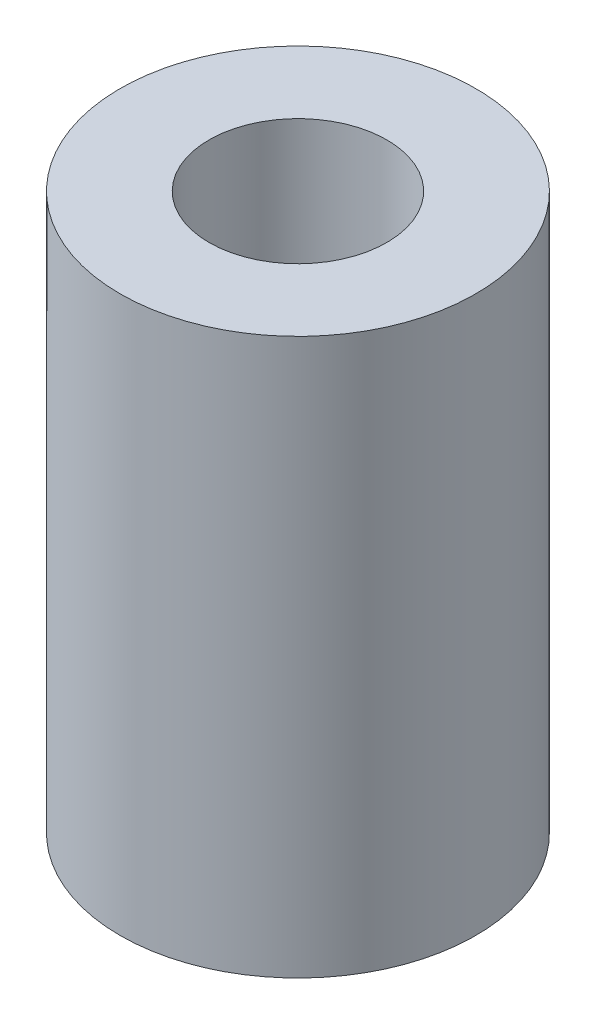
ISO-10303-21;
HEADER;
FILE_DESCRIPTION(('STEP AP214'),'2;1');
FILE_NAME('part.step','',(''),(''),'','','');
FILE_SCHEMA(('AUTOMOTIVE_DESIGN { 1 0 10303 214 1 1 1 1 }'));
ENDSEC;
DATA;
#1=APPLICATION_CONTEXT('core data for automotive mechanical design processes');
#2=APPLICATION_PROTOCOL_DEFINITION('international standard','automotive_design',2000,#1);
#3=PRODUCT_CONTEXT('',#1,'mechanical');
#4=PRODUCT('Part','Part','',(#3));
#5=PRODUCT_RELATED_PRODUCT_CATEGORY('part','',(#4));
#6=PRODUCT_DEFINITION_FORMATION('','',#4);
#7=PRODUCT_DEFINITION_CONTEXT('part definition',#1,'design');
#8=PRODUCT_DEFINITION('design','',#6,#7);
#9=PRODUCT_DEFINITION_SHAPE('','',#8);
#10=(LENGTH_UNIT() NAMED_UNIT(*) SI_UNIT(.MILLI.,.METRE.));
#11=(NAMED_UNIT(*) PLANE_ANGLE_UNIT() SI_UNIT($,.RADIAN.));
#12=(NAMED_UNIT(*) SI_UNIT($,.STERADIAN.) SOLID_ANGLE_UNIT());
#13=UNCERTAINTY_MEASURE_WITH_UNIT(LENGTH_MEASURE(1.E-05),#10,'distance_accuracy_value','');
#14=(GEOMETRIC_REPRESENTATION_CONTEXT(3) GLOBAL_UNCERTAINTY_ASSIGNED_CONTEXT((#13)) GLOBAL_UNIT_ASSIGNED_CONTEXT((#10,
#11,#12)) REPRESENTATION_CONTEXT('',''));
#15=CARTESIAN_POINT('',(0.,0.,0.));
#16=DIRECTION('',(0.,0.,1.));
#17=DIRECTION('',(1.,0.,0.));
#18=AXIS2_PLACEMENT_3D('',#15,#16,#17);
#19=CARTESIAN_POINT('',(0.,25.,0.));
#20=DIRECTION('',(0.,1.,0.));
#21=DIRECTION('',(0.,0.,1.));
#22=AXIS2_PLACEMENT_3D('',#19,#20,#21);
#23=PLANE('',#22);
#24=CARTESIAN_POINT('',(0.,25.,0.));
#25=DIRECTION('',(0.,1.,0.));
#26=DIRECTION('',(0.,0.,1.));
#27=AXIS2_PLACEMENT_3D('',#24,#25,#26);
#28=CIRCLE('',#27,8.);
#29=CARTESIAN_POINT('',(0.,25.,8.));
#30=VERTEX_POINT('',#29);
#31=EDGE_CURVE('E10',#30,#30,#28,.T.);
#32=ORIENTED_EDGE('',*,*,#31,.T.);
#33=EDGE_LOOP('',(#32));
#34=FACE_BOUND('',#33,.T.);
#35=CARTESIAN_POINT('',(0.,25.,0.));
#36=DIRECTION('',(0.,1.,0.));
#37=DIRECTION('',(0.,0.,1.));
#38=AXIS2_PLACEMENT_3D('',#35,#36,#37);
#39=CIRCLE('',#38,4.);
#40=CARTESIAN_POINT('',(0.,25.,4.));
#41=VERTEX_POINT('',#40);
#42=EDGE_CURVE('E41',#41,#41,#39,.T.);
#43=ORIENTED_EDGE('',*,*,#42,.F.);
#44=EDGE_LOOP('',(#43));
#45=FACE_BOUND('',#44,.T.);
#46=ADVANCED_FACE('F30',(#34,#45),#23,.T.);
#47=CARTESIAN_POINT('',(0.,0.,0.));
#48=DIRECTION('',(0.,1.,0.));
#49=DIRECTION('',(0.,0.,1.));
#50=AXIS2_PLACEMENT_3D('',#47,#48,#49);
#51=PLANE('',#50);
#52=CARTESIAN_POINT('',(0.,0.,0.));
#53=DIRECTION('',(0.,1.,0.));
#54=DIRECTION('',(0.,0.,1.));
#55=AXIS2_PLACEMENT_3D('',#52,#53,#54);
#56=CIRCLE('',#55,8.);
#57=CARTESIAN_POINT('',(0.,0.,8.));
#58=VERTEX_POINT('',#57);
#59=EDGE_CURVE('E34',#58,#58,#56,.T.);
#60=ORIENTED_EDGE('',*,*,#59,.F.);
#61=EDGE_LOOP('',(#60));
#62=FACE_BOUND('',#61,.T.);
#63=CARTESIAN_POINT('',(0.,0.,0.));
#64=DIRECTION('',(0.,1.,0.));
#65=DIRECTION('',(0.,0.,1.));
#66=AXIS2_PLACEMENT_3D('',#63,#64,#65);
#67=CIRCLE('',#66,4.);
#68=CARTESIAN_POINT('',(0.,0.,4.));
#69=VERTEX_POINT('',#68);
#70=EDGE_CURVE('E43',#69,#69,#67,.T.);
#71=ORIENTED_EDGE('',*,*,#70,.T.);
#72=EDGE_LOOP('',(#71));
#73=FACE_BOUND('',#72,.T.);
#74=ADVANCED_FACE('F53',(#62,#73),#51,.F.);
#75=CARTESIAN_POINT('',(0.,25.,0.));
#76=DIRECTION('',(0.,-1.,0.));
#77=DIRECTION('',(0.,0.,-1.));
#78=AXIS2_PLACEMENT_3D('',#75,#76,#77);
#79=CYLINDRICAL_SURFACE('',#78,8.);
#80=ORIENTED_EDGE('',*,*,#31,.F.);
#81=EDGE_LOOP('',(#80));
#82=FACE_BOUND('',#81,.T.);
#83=ORIENTED_EDGE('',*,*,#59,.T.);
#84=EDGE_LOOP('',(#83));
#85=FACE_BOUND('',#84,.T.);
#86=ADVANCED_FACE('F32',(#82,#85),#79,.T.);
#87=CARTESIAN_POINT('',(0.,25.,0.));
#88=DIRECTION('',(0.,-1.,0.));
#89=DIRECTION('',(0.,0.,-1.));
#90=AXIS2_PLACEMENT_3D('',#87,#88,#89);
#91=CYLINDRICAL_SURFACE('',#90,4.);
#92=ORIENTED_EDGE('',*,*,#42,.T.);
#93=EDGE_LOOP('',(#92));
#94=FACE_BOUND('',#93,.T.);
#95=ORIENTED_EDGE('',*,*,#70,.F.);
#96=EDGE_LOOP('',(#95));
#97=FACE_BOUND('',#96,.T.);
#98=ADVANCED_FACE('F49',(#94,#97),#91,.F.);
#99=CLOSED_SHELL('',(#46,#74,#86,#98));
#100=MANIFOLD_SOLID_BREP('B2',#99);
#101=ADVANCED_BREP_SHAPE_REPRESENTATION('',(#18,#100),#14);
#102=SHAPE_DEFINITION_REPRESENTATION(#9,#101);
ENDSEC;
END-ISO-10303-21;
